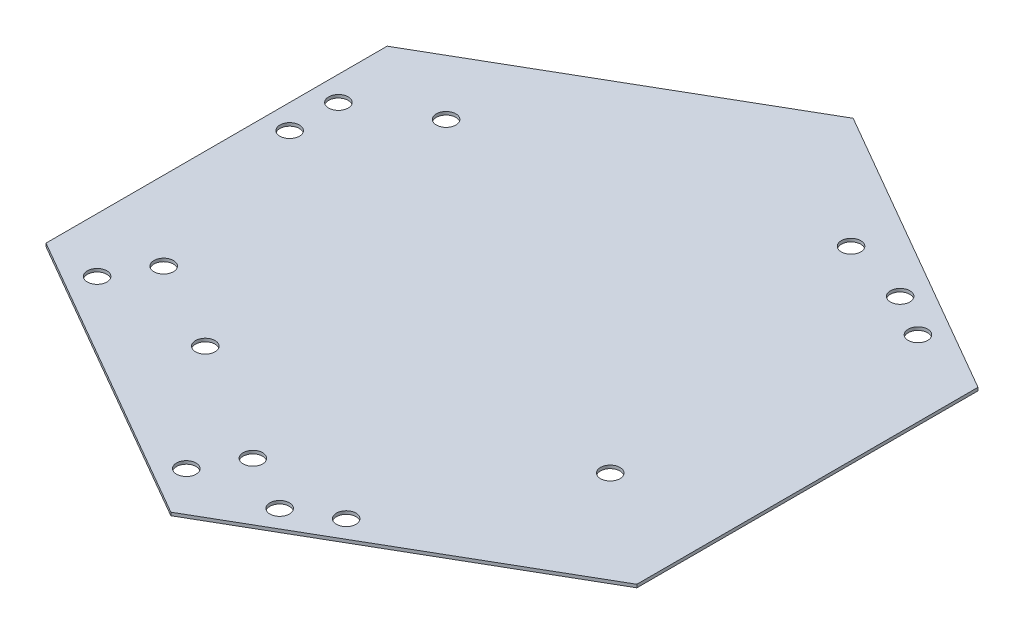
ISO-10303-21;
HEADER;
FILE_DESCRIPTION(('STEP AP214'),'2;1');
FILE_NAME('part.step','',(''),(''),'','','');
FILE_SCHEMA(('AUTOMOTIVE_DESIGN { 1 0 10303 214 1 1 1 1 }'));
ENDSEC;
DATA;
#1=APPLICATION_CONTEXT('core data for automotive mechanical design processes');
#2=APPLICATION_PROTOCOL_DEFINITION('international standard','automotive_design',2000,#1);
#3=PRODUCT_CONTEXT('',#1,'mechanical');
#4=PRODUCT('Part','Part','',(#3));
#5=PRODUCT_RELATED_PRODUCT_CATEGORY('part','',(#4));
#6=PRODUCT_DEFINITION_FORMATION('','',#4);
#7=PRODUCT_DEFINITION_CONTEXT('part definition',#1,'design');
#8=PRODUCT_DEFINITION('design','',#6,#7);
#9=PRODUCT_DEFINITION_SHAPE('','',#8);
#10=(LENGTH_UNIT() NAMED_UNIT(*) SI_UNIT(.MILLI.,.METRE.));
#11=(NAMED_UNIT(*) PLANE_ANGLE_UNIT() SI_UNIT($,.RADIAN.));
#12=(NAMED_UNIT(*) SI_UNIT($,.STERADIAN.) SOLID_ANGLE_UNIT());
#13=UNCERTAINTY_MEASURE_WITH_UNIT(LENGTH_MEASURE(1.E-05),#10,'distance_accuracy_value','');
#14=(GEOMETRIC_REPRESENTATION_CONTEXT(3) GLOBAL_UNCERTAINTY_ASSIGNED_CONTEXT((#13)) GLOBAL_UNIT_ASSIGNED_CONTEXT((#10,
#11,#12)) REPRESENTATION_CONTEXT('',''));
#15=CARTESIAN_POINT('',(0.,0.,0.));
#16=DIRECTION('',(0.,0.,1.));
#17=DIRECTION('',(1.,0.,0.));
#18=AXIS2_PLACEMENT_3D('',#15,#16,#17);
#19=CARTESIAN_POINT('',(0.,0.8128,0.));
#20=DIRECTION('',(0.,1.,0.));
#21=DIRECTION('',(0.,0.,1.));
#22=AXIS2_PLACEMENT_3D('',#19,#20,#21);
#23=PLANE('',#22);
#24=CARTESIAN_POINT('',(-7.82352262806189,0.8128,77.0507386859688));
#25=DIRECTION('',(0.,1.,0.));
#26=DIRECTION('',(0.,0.,1.));
#27=AXIS2_PLACEMENT_3D('',#24,#25,#26);
#28=CIRCLE('',#27,2.53999999999999);
#29=CARTESIAN_POINT('',(-7.82352262806189,0.8128,79.5907386859688));
#30=VERTEX_POINT('',#29);
#31=EDGE_CURVE('E226',#30,#30,#28,.T.);
#32=ORIENTED_EDGE('',*,*,#31,.F.);
#33=EDGE_LOOP('',(#32));
#34=FACE_BOUND('',#33,.T.);
#35=CARTESIAN_POINT('',(-62.816135768374,0.8128,45.3007386859691));
#36=DIRECTION('',(0.,1.,0.));
#37=DIRECTION('',(0.,0.,1.));
#38=AXIS2_PLACEMENT_3D('',#35,#36,#37);
#39=CIRCLE('',#38,2.54000000000001);
#40=CARTESIAN_POINT('',(-62.816135768374,0.8128,47.8407386859692));
#41=VERTEX_POINT('',#40);
#42=EDGE_CURVE('E232',#41,#41,#39,.T.);
#43=ORIENTED_EDGE('',*,*,#42,.F.);
#44=EDGE_LOOP('',(#43));
#45=FACE_BOUND('',#44,.T.);
#46=CARTESIAN_POINT('',(-56.466135768374,0.8128,34.3022160579067));
#47=DIRECTION('',(0.,1.,0.));
#48=DIRECTION('',(0.,0.,1.));
#49=AXIS2_PLACEMENT_3D('',#46,#47,#48);
#50=CIRCLE('',#49,2.54000000000003);
#51=CARTESIAN_POINT('',(-56.466135768374,0.8128,36.8422160579068));
#52=VERTEX_POINT('',#51);
#53=EDGE_CURVE('E240',#52,#52,#50,.T.);
#54=ORIENTED_EDGE('',*,*,#53,.F.);
#55=EDGE_LOOP('',(#54));
#56=FACE_BOUND('',#55,.T.);
#57=CARTESIAN_POINT('',(-1.47352262806199,0.8128,66.0522160579064));
#58=DIRECTION('',(0.,1.,0.));
#59=DIRECTION('',(0.,0.,1.));
#60=AXIS2_PLACEMENT_3D('',#57,#58,#59);
#61=CIRCLE('',#60,2.54);
#62=CARTESIAN_POINT('',(-1.47352262806199,0.8128,68.5922160579064));
#63=VERTEX_POINT('',#62);
#64=EDGE_CURVE('E246',#63,#63,#61,.T.);
#65=ORIENTED_EDGE('',*,*,#64,.F.);
#66=EDGE_LOOP('',(#65));
#67=FACE_BOUND('',#66,.T.);
#68=CARTESIAN_POINT('',(28.6205909487751,0.8128,-59.7323176659243));
#69=DIRECTION('',(0.,1.,0.));
#70=DIRECTION('',(0.,0.,1.));
#71=AXIS2_PLACEMENT_3D('',#68,#69,#70);
#72=CIRCLE('',#71,2.54);
#73=CARTESIAN_POINT('',(28.6205909487751,0.8128,-57.1923176659243));
#74=VERTEX_POINT('',#73);
#75=EDGE_CURVE('E253',#74,#74,#72,.T.);
#76=ORIENTED_EDGE('',*,*,#75,.F.);
#77=EDGE_LOOP('',(#76));
#78=FACE_BOUND('',#77,.T.);
#79=CARTESIAN_POINT('',(48.416295037862,0.8128,22.8205170801782));
#80=DIRECTION('',(0.,1.,0.));
#81=DIRECTION('',(0.,0.,1.));
#82=AXIS2_PLACEMENT_3D('',#79,#80,#81);
#83=CIRCLE('',#82,2.54);
#84=CARTESIAN_POINT('',(48.416295037862,0.8128,25.3605170801782));
#85=VERTEX_POINT('',#84);
#86=EDGE_CURVE('E259',#85,#85,#83,.T.);
#87=ORIENTED_EDGE('',*,*,#86,.F.);
#88=EDGE_LOOP('',(#87));
#89=FACE_BOUND('',#88,.T.);
#90=CARTESIAN_POINT('',(-52.7701131403118,0.8128,-35.5994829198218));
#91=DIRECTION('',(0.,1.,0.));
#92=DIRECTION('',(0.,0.,1.));
#93=AXIS2_PLACEMENT_3D('',#90,#91,#92);
#94=CIRCLE('',#93,2.54);
#95=CARTESIAN_POINT('',(-52.7701131403118,0.8128,-33.0594829198218));
#96=VERTEX_POINT('',#95);
#97=EDGE_CURVE('E265',#96,#96,#94,.T.);
#98=ORIENTED_EDGE('',*,*,#97,.F.);
#99=EDGE_LOOP('',(#98));
#100=FACE_BOUND('',#99,.T.);
#101=CARTESIAN_POINT('',(-32.9744090512249,0.8128,46.9533518262807));
#102=DIRECTION('',(0.,1.,0.));
#103=DIRECTION('',(0.,0.,1.));
#104=AXIS2_PLACEMENT_3D('',#101,#102,#103);
#105=CIRCLE('',#104,2.54);
#106=CARTESIAN_POINT('',(-32.9744090512249,0.8128,49.4933518262807));
#107=VERTEX_POINT('',#106);
#108=EDGE_CURVE('E229',#107,#107,#105,.T.);
#109=ORIENTED_EDGE('',*,*,#108,.F.);
#110=EDGE_LOOP('',(#109));
#111=FACE_BOUND('',#110,.T.);
#112=CARTESIAN_POINT('',(57.3168744543435,0.8128,-48.4757386859683));
#113=DIRECTION('',(0.,1.,0.));
#114=DIRECTION('',(0.,0.,1.));
#115=AXIS2_PLACEMENT_3D('',#112,#113,#114);
#116=CIRCLE('',#115,2.53999999999999);
#117=CARTESIAN_POINT('',(57.3168744543435,0.8128,-45.9357386859683));
#118=VERTEX_POINT('',#117);
#119=EDGE_CURVE('E279',#118,#118,#116,.T.);
#120=ORIENTED_EDGE('',*,*,#119,.F.);
#121=EDGE_LOOP('',(#120));
#122=FACE_BOUND('',#121,.T.);
#123=CARTESIAN_POINT('',(-70.6396583964365,0.8128,-25.4000000000004));
#124=DIRECTION('',(0.,1.,0.));
#125=DIRECTION('',(0.,0.,1.));
#126=AXIS2_PLACEMENT_3D('',#123,#124,#125);
#127=CIRCLE('',#126,2.54);
#128=CARTESIAN_POINT('',(-70.6396583964365,0.8128,-22.8600000000004));
#129=VERTEX_POINT('',#128);
#130=EDGE_CURVE('E291',#129,#129,#127,.T.);
#131=ORIENTED_EDGE('',*,*,#130,.F.);
#132=EDGE_LOOP('',(#131));
#133=FACE_BOUND('',#132,.T.);
#134=CARTESIAN_POINT('',(13.3227839420935,0.8128,73.8757386859688));
#135=DIRECTION('',(0.,1.,0.));
#136=DIRECTION('',(0.,0.,1.));
#137=AXIS2_PLACEMENT_3D('',#134,#135,#136);
#138=CIRCLE('',#137,2.53999999999999);
#139=CARTESIAN_POINT('',(13.3227839420935,0.8128,76.4157386859688));
#140=VERTEX_POINT('',#139);
#141=EDGE_CURVE('E125',#140,#140,#138,.T.);
#142=ORIENTED_EDGE('',*,*,#141,.F.);
#143=EDGE_LOOP('',(#142));
#144=FACE_BOUND('',#143,.T.);
#145=DIRECTION('',(-0.866025403784442,0.,-0.499999999999995));
#146=VECTOR('',#145,1.);
#147=CARTESIAN_POINT('',(76.9896583964361,0.8128,-44.4500000000009));
#148=LINE('',#147,#146);
#149=CARTESIAN_POINT('',(76.9896583964361,0.8128,-44.4500000000009));
#150=VERTEX_POINT('',#149);
#151=CARTESIAN_POINT('',(0.,0.8128,-88.9));
#152=VERTEX_POINT('',#151);
#153=EDGE_CURVE('E132',#150,#152,#148,.T.);
#154=ORIENTED_EDGE('',*,*,#153,.T.);
#155=DIRECTION('',(-0.866025403784438,0.,0.500000000000001));
#156=VECTOR('',#155,1.);
#157=CARTESIAN_POINT('',(0.,0.8128,-88.9));
#158=LINE('',#157,#156);
#159=CARTESIAN_POINT('',(-76.9896583964367,0.8128,-44.4499999999998));
#160=VERTEX_POINT('',#159);
#161=EDGE_CURVE('E90',#152,#160,#158,.T.);
#162=ORIENTED_EDGE('',*,*,#161,.T.);
#163=DIRECTION('',(0.,0.,1.));
#164=VECTOR('',#163,1.);
#165=CARTESIAN_POINT('',(-76.9896583964367,0.8128,-44.4499999999998));
#166=LINE('',#165,#164);
#167=CARTESIAN_POINT('',(-76.9896583964364,0.8128,44.4500000000004));
#168=VERTEX_POINT('',#167);
#169=EDGE_CURVE('E103',#160,#168,#166,.T.);
#170=ORIENTED_EDGE('',*,*,#169,.T.);
#171=DIRECTION('',(0.866025403784442,0.,0.499999999999995));
#172=VECTOR('',#171,1.);
#173=CARTESIAN_POINT('',(-76.9896583964364,0.8128,44.4500000000004));
#174=LINE('',#173,#172);
#175=CARTESIAN_POINT('',(6.20785382046309E-13,0.8128,88.9));
#176=VERTEX_POINT('',#175);
#177=EDGE_CURVE('E97',#168,#176,#174,.T.);
#178=ORIENTED_EDGE('',*,*,#177,.T.);
#179=DIRECTION('',(0.866025403784434,0.,-0.500000000000007));
#180=VECTOR('',#179,1.);
#181=CARTESIAN_POINT('',(6.20785382046309E-13,0.8128,88.9));
#182=LINE('',#181,#180);
#183=CARTESIAN_POINT('',(76.989658396437,0.8128,44.4499999999993));
#184=VERTEX_POINT('',#183);
#185=EDGE_CURVE('E101',#176,#184,#182,.T.);
#186=ORIENTED_EDGE('',*,*,#185,.T.);
#187=DIRECTION('',(0.,0.,-1.));
#188=VECTOR('',#187,1.);
#189=CARTESIAN_POINT('',(76.989658396437,0.8128,44.4499999999993));
#190=LINE('',#189,#188);
#191=EDGE_CURVE('E53',#184,#150,#190,.T.);
#192=ORIENTED_EDGE('',*,*,#191,.T.);
#193=EDGE_LOOP('',(#154,#162,#170,#178,#186,#192));
#194=FACE_BOUND('',#193,.T.);
#195=CARTESIAN_POINT('',(24.3213065701559,0.8128,67.5257386859688));
#196=DIRECTION('',(0.,1.,0.));
#197=DIRECTION('',(0.,0.,1.));
#198=AXIS2_PLACEMENT_3D('',#195,#196,#197);
#199=CIRCLE('',#198,2.53999999999999);
#200=CARTESIAN_POINT('',(24.3213065701559,0.8128,70.0657386859688));
#201=VERTEX_POINT('',#200);
#202=EDGE_CURVE('E297',#201,#201,#199,.T.);
#203=ORIENTED_EDGE('',*,*,#202,.F.);
#204=EDGE_LOOP('',(#203));
#205=FACE_BOUND('',#204,.T.);
#206=CARTESIAN_POINT('',(-70.6396583964365,0.8128,-12.7000000000003));
#207=DIRECTION('',(0.,1.,0.));
#208=DIRECTION('',(0.,0.,1.));
#209=AXIS2_PLACEMENT_3D('',#206,#207,#208);
#210=CIRCLE('',#209,2.53999999999999);
#211=CARTESIAN_POINT('',(-70.6396583964365,0.8128,-10.1600000000004));
#212=VERTEX_POINT('',#211);
#213=EDGE_CURVE('E285',#212,#212,#210,.T.);
#214=ORIENTED_EDGE('',*,*,#213,.F.);
#215=EDGE_LOOP('',(#214));
#216=FACE_BOUND('',#215,.T.);
#217=CARTESIAN_POINT('',(46.3183518262812,0.8128,-54.8257386859684));
#218=DIRECTION('',(0.,1.,0.));
#219=DIRECTION('',(0.,0.,1.));
#220=AXIS2_PLACEMENT_3D('',#217,#218,#219);
#221=CIRCLE('',#220,2.53999999999999);
#222=CARTESIAN_POINT('',(46.3183518262812,0.8128,-52.2857386859684));
#223=VERTEX_POINT('',#222);
#224=EDGE_CURVE('E273',#223,#223,#221,.T.);
#225=ORIENTED_EDGE('',*,*,#224,.F.);
#226=EDGE_LOOP('',(#225));
#227=FACE_BOUND('',#226,.T.);
#228=ADVANCED_FACE('F36',(#34,#45,#56,#67,#78,#89,#100,#111,#122,#133,#144,#194,#205,#216,#227),
#23,.T.);
#229=CARTESIAN_POINT('',(0.,0.,0.));
#230=DIRECTION('',(0.,1.,0.));
#231=DIRECTION('',(0.,0.,1.));
#232=AXIS2_PLACEMENT_3D('',#229,#230,#231);
#233=PLANE('',#232);
#234=CARTESIAN_POINT('',(-7.82352262806189,0.,77.0507386859688));
#235=DIRECTION('',(0.,1.,0.));
#236=DIRECTION('',(0.,0.,1.));
#237=AXIS2_PLACEMENT_3D('',#234,#235,#236);
#238=CIRCLE('',#237,2.53999999999999);
#239=CARTESIAN_POINT('',(-7.82352262806189,0.,79.5907386859688));
#240=VERTEX_POINT('',#239);
#241=EDGE_CURVE('E224',#240,#240,#238,.T.);
#242=ORIENTED_EDGE('',*,*,#241,.T.);
#243=EDGE_LOOP('',(#242));
#244=FACE_BOUND('',#243,.T.);
#245=CARTESIAN_POINT('',(-62.816135768374,0.,45.3007386859691));
#246=DIRECTION('',(0.,1.,0.));
#247=DIRECTION('',(0.,0.,1.));
#248=AXIS2_PLACEMENT_3D('',#245,#246,#247);
#249=CIRCLE('',#248,2.54000000000001);
#250=CARTESIAN_POINT('',(-62.816135768374,0.,47.8407386859692));
#251=VERTEX_POINT('',#250);
#252=EDGE_CURVE('E227',#251,#251,#249,.T.);
#253=ORIENTED_EDGE('',*,*,#252,.T.);
#254=EDGE_LOOP('',(#253));
#255=FACE_BOUND('',#254,.T.);
#256=CARTESIAN_POINT('',(-56.466135768374,0.,34.3022160579067));
#257=DIRECTION('',(0.,1.,0.));
#258=DIRECTION('',(0.,0.,1.));
#259=AXIS2_PLACEMENT_3D('',#256,#257,#258);
#260=CIRCLE('',#259,2.54000000000003);
#261=CARTESIAN_POINT('',(-56.466135768374,0.,36.8422160579068));
#262=VERTEX_POINT('',#261);
#263=EDGE_CURVE('E237',#262,#262,#260,.T.);
#264=ORIENTED_EDGE('',*,*,#263,.T.);
#265=EDGE_LOOP('',(#264));
#266=FACE_BOUND('',#265,.T.);
#267=CARTESIAN_POINT('',(-1.47352262806199,0.,66.0522160579064));
#268=DIRECTION('',(0.,1.,0.));
#269=DIRECTION('',(0.,0.,1.));
#270=AXIS2_PLACEMENT_3D('',#267,#268,#269);
#271=CIRCLE('',#270,2.54);
#272=CARTESIAN_POINT('',(-1.47352262806199,0.,68.5922160579064));
#273=VERTEX_POINT('',#272);
#274=EDGE_CURVE('E243',#273,#273,#271,.T.);
#275=ORIENTED_EDGE('',*,*,#274,.T.);
#276=EDGE_LOOP('',(#275));
#277=FACE_BOUND('',#276,.T.);
#278=CARTESIAN_POINT('',(28.6205909487751,0.,-59.7323176659243));
#279=DIRECTION('',(0.,1.,0.));
#280=DIRECTION('',(0.,0.,1.));
#281=AXIS2_PLACEMENT_3D('',#278,#279,#280);
#282=CIRCLE('',#281,2.54);
#283=CARTESIAN_POINT('',(28.6205909487751,0.,-57.1923176659243));
#284=VERTEX_POINT('',#283);
#285=EDGE_CURVE('E249',#284,#284,#282,.T.);
#286=ORIENTED_EDGE('',*,*,#285,.T.);
#287=EDGE_LOOP('',(#286));
#288=FACE_BOUND('',#287,.T.);
#289=CARTESIAN_POINT('',(48.416295037862,0.,22.8205170801782));
#290=DIRECTION('',(0.,1.,0.));
#291=DIRECTION('',(0.,0.,1.));
#292=AXIS2_PLACEMENT_3D('',#289,#290,#291);
#293=CIRCLE('',#292,2.54);
#294=CARTESIAN_POINT('',(48.416295037862,0.,25.3605170801782));
#295=VERTEX_POINT('',#294);
#296=EDGE_CURVE('E256',#295,#295,#293,.T.);
#297=ORIENTED_EDGE('',*,*,#296,.T.);
#298=EDGE_LOOP('',(#297));
#299=FACE_BOUND('',#298,.T.);
#300=CARTESIAN_POINT('',(-52.7701131403118,0.,-35.5994829198218));
#301=DIRECTION('',(0.,1.,0.));
#302=DIRECTION('',(0.,0.,1.));
#303=AXIS2_PLACEMENT_3D('',#300,#301,#302);
#304=CIRCLE('',#303,2.54);
#305=CARTESIAN_POINT('',(-52.7701131403118,0.,-33.0594829198218));
#306=VERTEX_POINT('',#305);
#307=EDGE_CURVE('E262',#306,#306,#304,.T.);
#308=ORIENTED_EDGE('',*,*,#307,.T.);
#309=EDGE_LOOP('',(#308));
#310=FACE_BOUND('',#309,.T.);
#311=CARTESIAN_POINT('',(-32.9744090512249,0.,46.9533518262807));
#312=DIRECTION('',(0.,1.,0.));
#313=DIRECTION('',(0.,0.,1.));
#314=AXIS2_PLACEMENT_3D('',#311,#312,#313);
#315=CIRCLE('',#314,2.54);
#316=CARTESIAN_POINT('',(-32.9744090512249,0.,49.4933518262807));
#317=VERTEX_POINT('',#316);
#318=EDGE_CURVE('E268',#317,#317,#315,.T.);
#319=ORIENTED_EDGE('',*,*,#318,.T.);
#320=EDGE_LOOP('',(#319));
#321=FACE_BOUND('',#320,.T.);
#322=DIRECTION('',(-0.866025403784442,0.,-0.499999999999995));
#323=VECTOR('',#322,1.);
#324=CARTESIAN_POINT('',(76.9896583964361,0.,-44.4500000000009));
#325=LINE('',#324,#323);
#326=CARTESIAN_POINT('',(76.9896583964361,0.,-44.4500000000009));
#327=VERTEX_POINT('',#326);
#328=CARTESIAN_POINT('',(0.,0.,-88.9));
#329=VERTEX_POINT('',#328);
#330=EDGE_CURVE('E121',#327,#329,#325,.T.);
#331=ORIENTED_EDGE('',*,*,#330,.F.);
#332=DIRECTION('',(0.,0.,-1.));
#333=VECTOR('',#332,1.);
#334=CARTESIAN_POINT('',(76.989658396437,0.,44.4499999999993));
#335=LINE('',#334,#333);
#336=CARTESIAN_POINT('',(76.989658396437,0.,44.4499999999993));
#337=VERTEX_POINT('',#336);
#338=EDGE_CURVE('E82',#337,#327,#335,.T.);
#339=ORIENTED_EDGE('',*,*,#338,.F.);
#340=DIRECTION('',(0.866025403784434,0.,-0.500000000000007));
#341=VECTOR('',#340,1.);
#342=CARTESIAN_POINT('',(6.20785382046309E-13,0.,88.9));
#343=LINE('',#342,#341);
#344=CARTESIAN_POINT('',(6.20785382046309E-13,0.,88.9));
#345=VERTEX_POINT('',#344);
#346=EDGE_CURVE('E76',#345,#337,#343,.T.);
#347=ORIENTED_EDGE('',*,*,#346,.F.);
#348=DIRECTION('',(0.866025403784442,0.,0.499999999999995));
#349=VECTOR('',#348,1.);
#350=CARTESIAN_POINT('',(-76.9896583964364,0.,44.4500000000004));
#351=LINE('',#350,#349);
#352=CARTESIAN_POINT('',(-76.9896583964364,0.,44.4500000000004));
#353=VERTEX_POINT('',#352);
#354=EDGE_CURVE('E111',#353,#345,#351,.T.);
#355=ORIENTED_EDGE('',*,*,#354,.F.);
#356=DIRECTION('',(0.,0.,1.));
#357=VECTOR('',#356,1.);
#358=CARTESIAN_POINT('',(-76.9896583964367,0.,-44.4499999999998));
#359=LINE('',#358,#357);
#360=CARTESIAN_POINT('',(-76.9896583964367,0.,-44.4499999999998));
#361=VERTEX_POINT('',#360);
#362=EDGE_CURVE('E127',#361,#353,#359,.T.);
#363=ORIENTED_EDGE('',*,*,#362,.F.);
#364=DIRECTION('',(-0.866025403784438,0.,0.500000000000001));
#365=VECTOR('',#364,1.);
#366=CARTESIAN_POINT('',(0.,0.,-88.9));
#367=LINE('',#366,#365);
#368=EDGE_CURVE('E124',#329,#361,#367,.T.);
#369=ORIENTED_EDGE('',*,*,#368,.F.);
#370=EDGE_LOOP('',(#331,#339,#347,#355,#363,#369));
#371=FACE_BOUND('',#370,.T.);
#372=CARTESIAN_POINT('',(13.3227839420935,0.,73.8757386859688));
#373=DIRECTION('',(0.,1.,0.));
#374=DIRECTION('',(0.,0.,1.));
#375=AXIS2_PLACEMENT_3D('',#372,#373,#374);
#376=CIRCLE('',#375,2.53999999999999);
#377=CARTESIAN_POINT('',(13.3227839420935,0.,76.4157386859688));
#378=VERTEX_POINT('',#377);
#379=EDGE_CURVE('E300',#378,#378,#376,.T.);
#380=ORIENTED_EDGE('',*,*,#379,.T.);
#381=EDGE_LOOP('',(#380));
#382=FACE_BOUND('',#381,.T.);
#383=CARTESIAN_POINT('',(24.3213065701559,0.,67.5257386859688));
#384=DIRECTION('',(0.,1.,0.));
#385=DIRECTION('',(0.,0.,1.));
#386=AXIS2_PLACEMENT_3D('',#383,#384,#385);
#387=CIRCLE('',#386,2.53999999999999);
#388=CARTESIAN_POINT('',(24.3213065701559,0.,70.0657386859688));
#389=VERTEX_POINT('',#388);
#390=EDGE_CURVE('E294',#389,#389,#387,.T.);
#391=ORIENTED_EDGE('',*,*,#390,.T.);
#392=EDGE_LOOP('',(#391));
#393=FACE_BOUND('',#392,.T.);
#394=CARTESIAN_POINT('',(-70.6396583964365,0.,-25.4000000000004));
#395=DIRECTION('',(0.,1.,0.));
#396=DIRECTION('',(0.,0.,1.));
#397=AXIS2_PLACEMENT_3D('',#394,#395,#396);
#398=CIRCLE('',#397,2.54);
#399=CARTESIAN_POINT('',(-70.6396583964365,0.,-22.8600000000004));
#400=VERTEX_POINT('',#399);
#401=EDGE_CURVE('E288',#400,#400,#398,.T.);
#402=ORIENTED_EDGE('',*,*,#401,.T.);
#403=EDGE_LOOP('',(#402));
#404=FACE_BOUND('',#403,.T.);
#405=CARTESIAN_POINT('',(-70.6396583964365,0.,-12.7000000000003));
#406=DIRECTION('',(0.,1.,0.));
#407=DIRECTION('',(0.,0.,1.));
#408=AXIS2_PLACEMENT_3D('',#405,#406,#407);
#409=CIRCLE('',#408,2.53999999999999);
#410=CARTESIAN_POINT('',(-70.6396583964365,0.,-10.1600000000004));
#411=VERTEX_POINT('',#410);
#412=EDGE_CURVE('E282',#411,#411,#409,.T.);
#413=ORIENTED_EDGE('',*,*,#412,.T.);
#414=EDGE_LOOP('',(#413));
#415=FACE_BOUND('',#414,.T.);
#416=CARTESIAN_POINT('',(57.3168744543435,0.,-48.4757386859683));
#417=DIRECTION('',(0.,1.,0.));
#418=DIRECTION('',(0.,0.,1.));
#419=AXIS2_PLACEMENT_3D('',#416,#417,#418);
#420=CIRCLE('',#419,2.53999999999999);
#421=CARTESIAN_POINT('',(57.3168744543435,0.,-45.9357386859683));
#422=VERTEX_POINT('',#421);
#423=EDGE_CURVE('E276',#422,#422,#420,.T.);
#424=ORIENTED_EDGE('',*,*,#423,.T.);
#425=EDGE_LOOP('',(#424));
#426=FACE_BOUND('',#425,.T.);
#427=CARTESIAN_POINT('',(46.3183518262812,0.,-54.8257386859684));
#428=DIRECTION('',(0.,1.,0.));
#429=DIRECTION('',(0.,0.,1.));
#430=AXIS2_PLACEMENT_3D('',#427,#428,#429);
#431=CIRCLE('',#430,2.53999999999999);
#432=CARTESIAN_POINT('',(46.3183518262812,0.,-52.2857386859684));
#433=VERTEX_POINT('',#432);
#434=EDGE_CURVE('E252',#433,#433,#431,.T.);
#435=ORIENTED_EDGE('',*,*,#434,.T.);
#436=EDGE_LOOP('',(#435));
#437=FACE_BOUND('',#436,.T.);
#438=ADVANCED_FACE('F141',(#244,#255,#266,#277,#288,#299,#310,#321,#371,#382,#393,#404,#415,
#426,#437),#233,.F.);
#439=CARTESIAN_POINT('',(76.9896583964361,0.8128,-44.4500000000009));
#440=DIRECTION('',(-0.499999999999995,0.,0.866025403784441));
#441=DIRECTION('',(0.866025403784441,0.,0.499999999999995));
#442=AXIS2_PLACEMENT_3D('',#439,#440,#441);
#443=PLANE('',#442);
#444=ORIENTED_EDGE('',*,*,#330,.T.);
#445=DIRECTION('',(0.,-1.,0.));
#446=VECTOR('',#445,1.);
#447=CARTESIAN_POINT('',(0.,0.8128,-88.9));
#448=LINE('',#447,#446);
#449=EDGE_CURVE('E11',#152,#329,#448,.T.);
#450=ORIENTED_EDGE('',*,*,#449,.F.);
#451=ORIENTED_EDGE('',*,*,#153,.F.);
#452=DIRECTION('',(0.,-1.,0.));
#453=VECTOR('',#452,1.);
#454=CARTESIAN_POINT('',(76.9896583964361,0.8128,-44.4500000000009));
#455=LINE('',#454,#453);
#456=EDGE_CURVE('E117',#150,#327,#455,.T.);
#457=ORIENTED_EDGE('',*,*,#456,.T.);
#458=EDGE_LOOP('',(#444,#450,#451,#457));
#459=FACE_BOUND('',#458,.T.);
#460=ADVANCED_FACE('F38',(#459),#443,.F.);
#461=CARTESIAN_POINT('',(0.,0.8128,-88.9));
#462=DIRECTION('',(0.500000000000001,0.,0.866025403784438));
#463=DIRECTION('',(0.866025403784438,0.,-0.500000000000001));
#464=AXIS2_PLACEMENT_3D('',#461,#462,#463);
#465=PLANE('',#464);
#466=ORIENTED_EDGE('',*,*,#368,.T.);
#467=DIRECTION('',(0.,-1.,0.));
#468=VECTOR('',#467,1.);
#469=CARTESIAN_POINT('',(-76.9896583964367,0.8128,-44.4499999999998));
#470=LINE('',#469,#468);
#471=EDGE_CURVE('E45',#160,#361,#470,.T.);
#472=ORIENTED_EDGE('',*,*,#471,.F.);
#473=ORIENTED_EDGE('',*,*,#161,.F.);
#474=ORIENTED_EDGE('',*,*,#449,.T.);
#475=EDGE_LOOP('',(#466,#472,#473,#474));
#476=FACE_BOUND('',#475,.T.);
#477=ADVANCED_FACE('F450',(#476),#465,.F.);
#478=CARTESIAN_POINT('',(-76.9896583964367,0.8128,-44.4499999999998));
#479=DIRECTION('',(1.,0.,0.));
#480=DIRECTION('',(0.,0.,-1.));
#481=AXIS2_PLACEMENT_3D('',#478,#479,#480);
#482=PLANE('',#481);
#483=ORIENTED_EDGE('',*,*,#362,.T.);
#484=DIRECTION('',(0.,-1.,0.));
#485=VECTOR('',#484,1.);
#486=CARTESIAN_POINT('',(-76.9896583964364,0.8128,44.4500000000004));
#487=LINE('',#486,#485);
#488=EDGE_CURVE('E112',#168,#353,#487,.T.);
#489=ORIENTED_EDGE('',*,*,#488,.F.);
#490=ORIENTED_EDGE('',*,*,#169,.F.);
#491=ORIENTED_EDGE('',*,*,#471,.T.);
#492=EDGE_LOOP('',(#483,#489,#490,#491));
#493=FACE_BOUND('',#492,.T.);
#494=ADVANCED_FACE('F138',(#493),#482,.F.);
#495=CARTESIAN_POINT('',(-76.9896583964364,0.8128,44.4500000000004));
#496=DIRECTION('',(0.499999999999995,0.,-0.866025403784442));
#497=DIRECTION('',(-0.866025403784442,0.,-0.499999999999995));
#498=AXIS2_PLACEMENT_3D('',#495,#496,#497);
#499=PLANE('',#498);
#500=ORIENTED_EDGE('',*,*,#354,.T.);
#501=DIRECTION('',(0.,-1.,0.));
#502=VECTOR('',#501,1.);
#503=CARTESIAN_POINT('',(6.20785382046309E-13,0.8128,88.9));
#504=LINE('',#503,#502);
#505=EDGE_CURVE('E108',#176,#345,#504,.T.);
#506=ORIENTED_EDGE('',*,*,#505,.F.);
#507=ORIENTED_EDGE('',*,*,#177,.F.);
#508=ORIENTED_EDGE('',*,*,#488,.T.);
#509=EDGE_LOOP('',(#500,#506,#507,#508));
#510=FACE_BOUND('',#509,.T.);
#511=ADVANCED_FACE('F109',(#510),#499,.F.);
#512=CARTESIAN_POINT('',(6.20785382046309E-13,0.8128,88.9));
#513=DIRECTION('',(-0.500000000000007,0.,-0.866025403784435));
#514=DIRECTION('',(-0.866025403784435,0.,0.500000000000007));
#515=AXIS2_PLACEMENT_3D('',#512,#513,#514);
#516=PLANE('',#515);
#517=ORIENTED_EDGE('',*,*,#346,.T.);
#518=DIRECTION('',(0.,-1.,0.));
#519=VECTOR('',#518,1.);
#520=CARTESIAN_POINT('',(76.989658396437,0.8128,44.4499999999993));
#521=LINE('',#520,#519);
#522=EDGE_CURVE('E113',#184,#337,#521,.T.);
#523=ORIENTED_EDGE('',*,*,#522,.F.);
#524=ORIENTED_EDGE('',*,*,#185,.F.);
#525=ORIENTED_EDGE('',*,*,#505,.T.);
#526=EDGE_LOOP('',(#517,#523,#524,#525));
#527=FACE_BOUND('',#526,.T.);
#528=ADVANCED_FACE('F115',(#527),#516,.F.);
#529=CARTESIAN_POINT('',(76.989658396437,0.8128,44.4499999999993));
#530=DIRECTION('',(-1.,0.,0.));
#531=DIRECTION('',(0.,0.,1.));
#532=AXIS2_PLACEMENT_3D('',#529,#530,#531);
#533=PLANE('',#532);
#534=ORIENTED_EDGE('',*,*,#338,.T.);
#535=ORIENTED_EDGE('',*,*,#456,.F.);
#536=ORIENTED_EDGE('',*,*,#191,.F.);
#537=ORIENTED_EDGE('',*,*,#522,.T.);
#538=EDGE_LOOP('',(#534,#535,#536,#537));
#539=FACE_BOUND('',#538,.T.);
#540=ADVANCED_FACE('F146',(#539),#533,.F.);
#541=CARTESIAN_POINT('',(13.3227839420935,0.8128,73.8757386859688));
#542=DIRECTION('',(0.,-1.,0.));
#543=DIRECTION('',(0.,0.,-1.));
#544=AXIS2_PLACEMENT_3D('',#541,#542,#543);
#545=CYLINDRICAL_SURFACE('',#544,2.53999999999999);
#546=ORIENTED_EDGE('',*,*,#141,.T.);
#547=EDGE_LOOP('',(#546));
#548=FACE_BOUND('',#547,.T.);
#549=ORIENTED_EDGE('',*,*,#379,.F.);
#550=EDGE_LOOP('',(#549));
#551=FACE_BOUND('',#550,.T.);
#552=ADVANCED_FACE('F148',(#548,#551),#545,.F.);
#553=CARTESIAN_POINT('',(24.3213065701559,0.8128,67.5257386859688));
#554=DIRECTION('',(0.,-1.,0.));
#555=DIRECTION('',(0.,0.,-1.));
#556=AXIS2_PLACEMENT_3D('',#553,#554,#555);
#557=CYLINDRICAL_SURFACE('',#556,2.53999999999999);
#558=ORIENTED_EDGE('',*,*,#202,.T.);
#559=EDGE_LOOP('',(#558));
#560=FACE_BOUND('',#559,.T.);
#561=ORIENTED_EDGE('',*,*,#390,.F.);
#562=EDGE_LOOP('',(#561));
#563=FACE_BOUND('',#562,.T.);
#564=ADVANCED_FACE('F154',(#560,#563),#557,.F.);
#565=CARTESIAN_POINT('',(-70.6396583964365,0.8128,-25.4000000000004));
#566=DIRECTION('',(0.,-1.,0.));
#567=DIRECTION('',(0.,0.,-1.));
#568=AXIS2_PLACEMENT_3D('',#565,#566,#567);
#569=CYLINDRICAL_SURFACE('',#568,2.54);
#570=ORIENTED_EDGE('',*,*,#130,.T.);
#571=EDGE_LOOP('',(#570));
#572=FACE_BOUND('',#571,.T.);
#573=ORIENTED_EDGE('',*,*,#401,.F.);
#574=EDGE_LOOP('',(#573));
#575=FACE_BOUND('',#574,.T.);
#576=ADVANCED_FACE('F171',(#572,#575),#569,.F.);
#577=CARTESIAN_POINT('',(-70.6396583964365,0.8128,-12.7000000000003));
#578=DIRECTION('',(0.,-1.,0.));
#579=DIRECTION('',(0.,0.,-1.));
#580=AXIS2_PLACEMENT_3D('',#577,#578,#579);
#581=CYLINDRICAL_SURFACE('',#580,2.53999999999999);
#582=ORIENTED_EDGE('',*,*,#213,.T.);
#583=EDGE_LOOP('',(#582));
#584=FACE_BOUND('',#583,.T.);
#585=ORIENTED_EDGE('',*,*,#412,.F.);
#586=EDGE_LOOP('',(#585));
#587=FACE_BOUND('',#586,.T.);
#588=ADVANCED_FACE('F175',(#584,#587),#581,.F.);
#589=CARTESIAN_POINT('',(57.3168744543435,0.8128,-48.4757386859683));
#590=DIRECTION('',(0.,-1.,0.));
#591=DIRECTION('',(0.,0.,-1.));
#592=AXIS2_PLACEMENT_3D('',#589,#590,#591);
#593=CYLINDRICAL_SURFACE('',#592,2.53999999999999);
#594=ORIENTED_EDGE('',*,*,#119,.T.);
#595=EDGE_LOOP('',(#594));
#596=FACE_BOUND('',#595,.T.);
#597=ORIENTED_EDGE('',*,*,#423,.F.);
#598=EDGE_LOOP('',(#597));
#599=FACE_BOUND('',#598,.T.);
#600=ADVANCED_FACE('F179',(#596,#599),#593,.F.);
#601=CARTESIAN_POINT('',(46.3183518262812,0.8128,-54.8257386859684));
#602=DIRECTION('',(0.,-1.,0.));
#603=DIRECTION('',(0.,0.,-1.));
#604=AXIS2_PLACEMENT_3D('',#601,#602,#603);
#605=CYLINDRICAL_SURFACE('',#604,2.53999999999999);
#606=ORIENTED_EDGE('',*,*,#224,.T.);
#607=EDGE_LOOP('',(#606));
#608=FACE_BOUND('',#607,.T.);
#609=ORIENTED_EDGE('',*,*,#434,.F.);
#610=EDGE_LOOP('',(#609));
#611=FACE_BOUND('',#610,.T.);
#612=ADVANCED_FACE('F183',(#608,#611),#605,.F.);
#613=CARTESIAN_POINT('',(-32.9744090512249,0.,46.9533518262807));
#614=DIRECTION('',(0.,1.,0.));
#615=DIRECTION('',(0.,0.,1.));
#616=AXIS2_PLACEMENT_3D('',#613,#614,#615);
#617=CYLINDRICAL_SURFACE('',#616,2.54);
#618=ORIENTED_EDGE('',*,*,#318,.F.);
#619=EDGE_LOOP('',(#618));
#620=FACE_BOUND('',#619,.T.);
#621=ORIENTED_EDGE('',*,*,#108,.T.);
#622=EDGE_LOOP('',(#621));
#623=FACE_BOUND('',#622,.T.);
#624=ADVANCED_FACE('F187',(#620,#623),#617,.F.);
#625=CARTESIAN_POINT('',(-52.7701131403118,0.,-35.5994829198218));
#626=DIRECTION('',(0.,1.,0.));
#627=DIRECTION('',(0.,0.,1.));
#628=AXIS2_PLACEMENT_3D('',#625,#626,#627);
#629=CYLINDRICAL_SURFACE('',#628,2.54);
#630=ORIENTED_EDGE('',*,*,#307,.F.);
#631=EDGE_LOOP('',(#630));
#632=FACE_BOUND('',#631,.T.);
#633=ORIENTED_EDGE('',*,*,#97,.T.);
#634=EDGE_LOOP('',(#633));
#635=FACE_BOUND('',#634,.T.);
#636=ADVANCED_FACE('F191',(#632,#635),#629,.F.);
#637=CARTESIAN_POINT('',(48.416295037862,0.,22.8205170801782));
#638=DIRECTION('',(0.,1.,0.));
#639=DIRECTION('',(0.,0.,1.));
#640=AXIS2_PLACEMENT_3D('',#637,#638,#639);
#641=CYLINDRICAL_SURFACE('',#640,2.54);
#642=ORIENTED_EDGE('',*,*,#296,.F.);
#643=EDGE_LOOP('',(#642));
#644=FACE_BOUND('',#643,.T.);
#645=ORIENTED_EDGE('',*,*,#86,.T.);
#646=EDGE_LOOP('',(#645));
#647=FACE_BOUND('',#646,.T.);
#648=ADVANCED_FACE('F195',(#644,#647),#641,.F.);
#649=CARTESIAN_POINT('',(28.6205909487751,0.,-59.7323176659243));
#650=DIRECTION('',(0.,1.,0.));
#651=DIRECTION('',(0.,0.,1.));
#652=AXIS2_PLACEMENT_3D('',#649,#650,#651);
#653=CYLINDRICAL_SURFACE('',#652,2.54);
#654=ORIENTED_EDGE('',*,*,#285,.F.);
#655=EDGE_LOOP('',(#654));
#656=FACE_BOUND('',#655,.T.);
#657=ORIENTED_EDGE('',*,*,#75,.T.);
#658=EDGE_LOOP('',(#657));
#659=FACE_BOUND('',#658,.T.);
#660=ADVANCED_FACE('F199',(#656,#659),#653,.F.);
#661=CARTESIAN_POINT('',(-1.47352262806199,0.,66.0522160579064));
#662=DIRECTION('',(0.,1.,0.));
#663=DIRECTION('',(0.,0.,1.));
#664=AXIS2_PLACEMENT_3D('',#661,#662,#663);
#665=CYLINDRICAL_SURFACE('',#664,2.54);
#666=ORIENTED_EDGE('',*,*,#274,.F.);
#667=EDGE_LOOP('',(#666));
#668=FACE_BOUND('',#667,.T.);
#669=ORIENTED_EDGE('',*,*,#64,.T.);
#670=EDGE_LOOP('',(#669));
#671=FACE_BOUND('',#670,.T.);
#672=ADVANCED_FACE('F203',(#668,#671),#665,.F.);
#673=CARTESIAN_POINT('',(-56.466135768374,0.,34.3022160579067));
#674=DIRECTION('',(0.,1.,0.));
#675=DIRECTION('',(0.,0.,1.));
#676=AXIS2_PLACEMENT_3D('',#673,#674,#675);
#677=CYLINDRICAL_SURFACE('',#676,2.54000000000003);
#678=ORIENTED_EDGE('',*,*,#263,.F.);
#679=EDGE_LOOP('',(#678));
#680=FACE_BOUND('',#679,.T.);
#681=ORIENTED_EDGE('',*,*,#53,.T.);
#682=EDGE_LOOP('',(#681));
#683=FACE_BOUND('',#682,.T.);
#684=ADVANCED_FACE('F207',(#680,#683),#677,.F.);
#685=CARTESIAN_POINT('',(-62.816135768374,0.,45.3007386859691));
#686=DIRECTION('',(0.,1.,0.));
#687=DIRECTION('',(0.,0.,1.));
#688=AXIS2_PLACEMENT_3D('',#685,#686,#687);
#689=CYLINDRICAL_SURFACE('',#688,2.54000000000001);
#690=ORIENTED_EDGE('',*,*,#252,.F.);
#691=EDGE_LOOP('',(#690));
#692=FACE_BOUND('',#691,.T.);
#693=ORIENTED_EDGE('',*,*,#42,.T.);
#694=EDGE_LOOP('',(#693));
#695=FACE_BOUND('',#694,.T.);
#696=ADVANCED_FACE('F211',(#692,#695),#689,.F.);
#697=CARTESIAN_POINT('',(-7.82352262806189,0.,77.0507386859688));
#698=DIRECTION('',(0.,1.,0.));
#699=DIRECTION('',(0.,0.,1.));
#700=AXIS2_PLACEMENT_3D('',#697,#698,#699);
#701=CYLINDRICAL_SURFACE('',#700,2.53999999999999);
#702=ORIENTED_EDGE('',*,*,#241,.F.);
#703=EDGE_LOOP('',(#702));
#704=FACE_BOUND('',#703,.T.);
#705=ORIENTED_EDGE('',*,*,#31,.T.);
#706=EDGE_LOOP('',(#705));
#707=FACE_BOUND('',#706,.T.);
#708=ADVANCED_FACE('F215',(#704,#707),#701,.F.);
#709=CLOSED_SHELL('',(#228,#438,#460,#477,#494,#511,#528,#540,#552,#564,#576,#588,#600,#612,
#624,#636,#648,#660,#672,#684,#696,#708));
#710=MANIFOLD_SOLID_BREP('B2',#709);
#711=ADVANCED_BREP_SHAPE_REPRESENTATION('',(#18,#710),#14);
#712=SHAPE_DEFINITION_REPRESENTATION(#9,#711);
ENDSEC;
END-ISO-10303-21;
